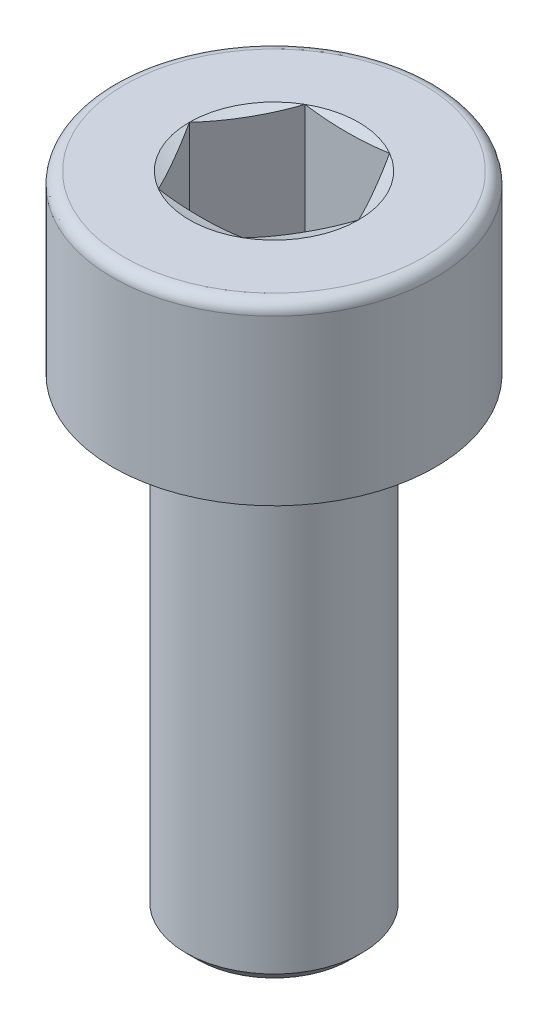
ISO-10303-21;
HEADER;
FILE_DESCRIPTION(('STEP AP214'),'2;1');
FILE_NAME('part.step','',(''),(''),'','','');
FILE_SCHEMA(('AUTOMOTIVE_DESIGN { 1 0 10303 214 1 1 1 1 }'));
ENDSEC;
DATA;
#1=APPLICATION_CONTEXT('core data for automotive mechanical design processes');
#2=APPLICATION_PROTOCOL_DEFINITION('international standard','automotive_design',2000,#1);
#3=PRODUCT_CONTEXT('',#1,'mechanical');
#4=PRODUCT('Part','Part','',(#3));
#5=PRODUCT_RELATED_PRODUCT_CATEGORY('part','',(#4));
#6=PRODUCT_DEFINITION_FORMATION('','',#4);
#7=PRODUCT_DEFINITION_CONTEXT('part definition',#1,'design');
#8=PRODUCT_DEFINITION('design','',#6,#7);
#9=PRODUCT_DEFINITION_SHAPE('','',#8);
#10=(LENGTH_UNIT() NAMED_UNIT(*) SI_UNIT(.MILLI.,.METRE.));
#11=(NAMED_UNIT(*) PLANE_ANGLE_UNIT() SI_UNIT($,.RADIAN.));
#12=(NAMED_UNIT(*) SI_UNIT($,.STERADIAN.) SOLID_ANGLE_UNIT());
#13=UNCERTAINTY_MEASURE_WITH_UNIT(LENGTH_MEASURE(1.E-05),#10,'distance_accuracy_value','');
#14=(GEOMETRIC_REPRESENTATION_CONTEXT(3) GLOBAL_UNCERTAINTY_ASSIGNED_CONTEXT((#13)) GLOBAL_UNIT_ASSIGNED_CONTEXT((#10,
#11,#12)) REPRESENTATION_CONTEXT('',''));
#15=CARTESIAN_POINT('',(0.,0.,0.));
#16=DIRECTION('',(0.,0.,1.));
#17=DIRECTION('',(1.,0.,0.));
#18=AXIS2_PLACEMENT_3D('',#15,#16,#17);
#19=CARTESIAN_POINT('',(-0.721687836487032,1.,1.25));
#20=DIRECTION('',(-0.866025403784438,0.,0.5));
#21=DIRECTION('',(0.5,0.,0.866025403784438));
#22=AXIS2_PLACEMENT_3D('',#19,#20,#21);
#23=PLANE('',#22);
#24=CARTESIAN_POINT('',(-0.721687836487033,3.,1.25));
#25=CARTESIAN_POINT('',(-0.746513124830629,2.99197238531374,1.20700133927634));
#26=CARTESIAN_POINT('',(-0.77141135372941,2.98490176746172,1.16387634180517));
#27=CARTESIAN_POINT('',(-0.821315773136171,2.97255913474823,1.07743935187044));
#28=CARTESIAN_POINT('',(-0.846321947696915,2.96728686283765,1.03412738702829));
#29=CARTESIAN_POINT('',(-0.921207679089363,2.95403550093664,0.904421495494619));
#30=CARTESIAN_POINT('',(-0.971201450687432,2.94854460534836,0.817829743024769));
#31=CARTESIAN_POINT('',(-1.05639422799085,2.94434178449894,0.670271524297353));
#32=CARTESIAN_POINT('',(-1.091578665675,2.94410115539927,0.609330290592659));
#33=CARTESIAN_POINT('',(-1.16192112047074,2.94660140173926,0.487493584957328));
#34=CARTESIAN_POINT('',(-1.19707913913524,2.94934208553123,0.426598110336959));
#35=CARTESIAN_POINT('',(-1.26754233377786,2.95799567884213,0.304552277152318));
#36=CARTESIAN_POINT('',(-1.30284686200085,2.96393024637964,0.243403040532844));
#37=CARTESIAN_POINT('',(-1.37327394982157,2.9792802908976,0.121419746198257));
#38=CARTESIAN_POINT('',(-1.40839646122585,2.98869664635053,0.0605857719566225));
#39=CARTESIAN_POINT('',(-1.44337567297406,3.,0.));
#40=B_SPLINE_CURVE_WITH_KNOTS('',3,(#24,#25,#26,#27,#28,#29,#30,#31,#32,#33,#34,#35,#36,#37,#38,
#39),.UNSPECIFIED.,.F.,.F.,(4,2,2,2,2,2,2,4),(0.,0.150861973818663,0.301702374924401,
0.601886293911623,0.812941524612173,1.02398318885367,1.23647431745907,1.44901909526101),.UNSPECIFIED.);
#41=CARTESIAN_POINT('',(-0.721687836487033,3.,1.25));
#42=VERTEX_POINT('',#41);
#43=CARTESIAN_POINT('',(-1.44337567297406,3.,0.));
#44=VERTEX_POINT('',#43);
#45=EDGE_CURVE('E81',#42,#44,#40,.T.);
#46=ORIENTED_EDGE('',*,*,#45,.F.);
#47=DIRECTION('',(0.,1.,0.));
#48=VECTOR('',#47,1.);
#49=CARTESIAN_POINT('',(-0.721687836487032,1.,1.25));
#50=LINE('',#49,#48);
#51=CARTESIAN_POINT('',(-0.721687836487032,1.,1.25));
#52=VERTEX_POINT('',#51);
#53=EDGE_CURVE('E117',#42,#52,#50,.F.);
#54=ORIENTED_EDGE('',*,*,#53,.T.);
#55=DIRECTION('',(0.5,0.,0.866025403784438));
#56=VECTOR('',#55,1.);
#57=CARTESIAN_POINT('',(-0.721687836487032,1.,1.25));
#58=LINE('',#57,#56);
#59=CARTESIAN_POINT('',(-1.44337567297406,1.,0.));
#60=VERTEX_POINT('',#59);
#61=EDGE_CURVE('E90',#60,#52,#58,.T.);
#62=ORIENTED_EDGE('',*,*,#61,.F.);
#63=DIRECTION('',(0.,1.,0.));
#64=VECTOR('',#63,1.);
#65=CARTESIAN_POINT('',(-1.44337567297406,1.,0.));
#66=LINE('',#65,#64);
#67=EDGE_CURVE('E89',#60,#44,#66,.T.);
#68=ORIENTED_EDGE('',*,*,#67,.T.);
#69=EDGE_LOOP('',(#46,#54,#62,#68));
#70=FACE_BOUND('',#69,.T.);
#71=ADVANCED_FACE('F17',(#70),#23,.F.);
#72=CARTESIAN_POINT('',(-1.44337567297406,1.,0.));
#73=DIRECTION('',(-0.866025403784439,0.,-0.5));
#74=DIRECTION('',(-0.5,0.,0.866025403784439));
#75=AXIS2_PLACEMENT_3D('',#72,#73,#74);
#76=PLANE('',#75);
#77=CARTESIAN_POINT('',(-1.44337567297406,3.,0.));
#78=CARTESIAN_POINT('',(-1.41855038463047,2.99197238531374,-0.0429986607236559));
#79=CARTESIAN_POINT('',(-1.39365215573169,2.98490176746172,-0.0861236581948248));
#80=CARTESIAN_POINT('',(-1.34374773632493,2.97255913474823,-0.172560648129561));
#81=CARTESIAN_POINT('',(-1.31874156176418,2.96728686283765,-0.215872612971707));
#82=CARTESIAN_POINT('',(-1.24385583037173,2.95403550093664,-0.345578504505381));
#83=CARTESIAN_POINT('',(-1.19386205877367,2.94854460534836,-0.432170256975231));
#84=CARTESIAN_POINT('',(-1.10866928147025,2.94434178449894,-0.579728475702646));
#85=CARTESIAN_POINT('',(-1.0734848437861,2.94410115539927,-0.64066970940734));
#86=CARTESIAN_POINT('',(-1.00314238899036,2.94660140173926,-0.762506415042672));
#87=CARTESIAN_POINT('',(-0.967984370325861,2.94934208553123,-0.823401889663041));
#88=CARTESIAN_POINT('',(-0.897521175683237,2.95799567884213,-0.945447722847682));
#89=CARTESIAN_POINT('',(-0.862216647460244,2.96393024637964,-1.00659695946716));
#90=CARTESIAN_POINT('',(-0.791789559639533,2.9792802908976,-1.12858025380174));
#91=CARTESIAN_POINT('',(-0.756667048235251,2.98869664635053,-1.18941422804338));
#92=CARTESIAN_POINT('',(-0.721687836487034,3.,-1.25));
#93=B_SPLINE_CURVE_WITH_KNOTS('',3,(#77,#78,#79,#80,#81,#82,#83,#84,#85,#86,#87,#88,#89,#90,#91,
#92),.UNSPECIFIED.,.F.,.F.,(4,2,2,2,2,2,2,4),(0.,0.150861973818663,0.301702374924401,
0.601886293911623,0.812941524612173,1.02398318885367,1.23647431745907,1.449019095261),.UNSPECIFIED.);
#94=CARTESIAN_POINT('',(-0.721687836487032,3.,-1.25));
#95=VERTEX_POINT('',#94);
#96=EDGE_CURVE('E96',#44,#95,#93,.T.);
#97=ORIENTED_EDGE('',*,*,#96,.F.);
#98=ORIENTED_EDGE('',*,*,#67,.F.);
#99=DIRECTION('',(0.5,0.,-0.866025403784439));
#100=VECTOR('',#99,1.);
#101=CARTESIAN_POINT('',(-1.44337567297406,1.,0.));
#102=LINE('',#101,#100);
#103=CARTESIAN_POINT('',(-0.721687836487033,1.,-1.25));
#104=VERTEX_POINT('',#103);
#105=EDGE_CURVE('E228',#60,#104,#102,.T.);
#106=ORIENTED_EDGE('',*,*,#105,.T.);
#107=DIRECTION('',(0.,1.,0.));
#108=VECTOR('',#107,1.);
#109=CARTESIAN_POINT('',(-0.721687836487033,1.,-1.25));
#110=LINE('',#109,#108);
#111=EDGE_CURVE('E115',#104,#95,#110,.T.);
#112=ORIENTED_EDGE('',*,*,#111,.T.);
#113=EDGE_LOOP('',(#97,#98,#106,#112));
#114=FACE_BOUND('',#113,.T.);
#115=ADVANCED_FACE('F113',(#114),#76,.F.);
#116=CARTESIAN_POINT('',(0.721687836487032,1.,1.25));
#117=DIRECTION('',(0.,0.,1.));
#118=DIRECTION('',(1.,0.,0.));
#119=AXIS2_PLACEMENT_3D('',#116,#117,#118);
#120=PLANE('',#119);
#121=CARTESIAN_POINT('',(0.721687836487032,3.,1.25));
#122=CARTESIAN_POINT('',(0.67203725979984,2.99197238531374,1.25));
#123=CARTESIAN_POINT('',(0.622240802002277,2.98490176746172,1.25));
#124=CARTESIAN_POINT('',(0.522431963188756,2.97255913474823,1.25));
#125=CARTESIAN_POINT('',(0.472419614067267,2.96728686283765,1.25));
#126=CARTESIAN_POINT('',(0.322648151282372,2.95403550093664,1.25));
#127=CARTESIAN_POINT('',(0.222660608086233,2.94854460534836,1.25));
#128=CARTESIAN_POINT('',(0.0522750534794036,2.94434178449894,1.25));
#129=CARTESIAN_POINT('',(-0.0180938218889025,2.94410115539927,1.25));
#130=CARTESIAN_POINT('',(-0.158778731480374,2.94660140173926,1.25));
#131=CARTESIAN_POINT('',(-0.229094768809375,2.94934208553123,1.25));
#132=CARTESIAN_POINT('',(-0.370021158094624,2.95799567884213,1.25));
#133=CARTESIAN_POINT('',(-0.44063021454061,2.96393024637964,1.25));
#134=CARTESIAN_POINT('',(-0.581484390182033,2.9792802908976,1.25));
#135=CARTESIAN_POINT('',(-0.651729412990597,2.98869664635053,1.25));
#136=CARTESIAN_POINT('',(-0.721687836487032,3.,1.25));
#137=B_SPLINE_CURVE_WITH_KNOTS('',3,(#121,#122,#123,#124,#125,#126,#127,#128,#129,#130,#131,
#132,#133,#134,#135,#136),.UNSPECIFIED.,.F.,.F.,(4,2,2,2,2,2,2,4),(0.,0.150861973818663,
0.301702374924401,0.601886293911623,0.812941524612173,1.02398318885367,1.23647431745907,
1.44901909526101),.UNSPECIFIED.);
#138=CARTESIAN_POINT('',(0.721687836487033,3.,1.25));
#139=VERTEX_POINT('',#138);
#140=EDGE_CURVE('E75',#139,#42,#137,.T.);
#141=ORIENTED_EDGE('',*,*,#140,.F.);
#142=DIRECTION('',(0.,1.,0.));
#143=VECTOR('',#142,1.);
#144=CARTESIAN_POINT('',(0.721687836487032,1.,1.25));
#145=LINE('',#144,#143);
#146=CARTESIAN_POINT('',(0.721687836487032,1.,1.25));
#147=VERTEX_POINT('',#146);
#148=EDGE_CURVE('E211',#139,#147,#145,.F.);
#149=ORIENTED_EDGE('',*,*,#148,.T.);
#150=DIRECTION('',(1.,0.,0.));
#151=VECTOR('',#150,1.);
#152=CARTESIAN_POINT('',(-0.721687836487033,1.,1.25));
#153=LINE('',#152,#151);
#154=EDGE_CURVE('E232',#147,#52,#153,.F.);
#155=ORIENTED_EDGE('',*,*,#154,.T.);
#156=ORIENTED_EDGE('',*,*,#53,.F.);
#157=EDGE_LOOP('',(#141,#149,#155,#156));
#158=FACE_BOUND('',#157,.T.);
#159=ADVANCED_FACE('F138',(#158),#120,.F.);
#160=CARTESIAN_POINT('',(-0.721687836487033,1.,-1.25));
#161=DIRECTION('',(0.,-1.,0.));
#162=DIRECTION('',(0.,0.,-1.));
#163=AXIS2_PLACEMENT_3D('',#160,#161,#162);
#164=PLANE('',#163);
#165=ORIENTED_EDGE('',*,*,#61,.T.);
#166=ORIENTED_EDGE('',*,*,#154,.F.);
#167=DIRECTION('',(0.5,0.,-0.866025403784438));
#168=VECTOR('',#167,1.);
#169=CARTESIAN_POINT('',(1.44337567297406,1.,0.));
#170=LINE('',#169,#168);
#171=CARTESIAN_POINT('',(1.44337567297406,1.,0.));
#172=VERTEX_POINT('',#171);
#173=EDGE_CURVE('E160',#147,#172,#170,.T.);
#174=ORIENTED_EDGE('',*,*,#173,.T.);
#175=DIRECTION('',(-0.5,0.,-0.866025403784439));
#176=VECTOR('',#175,1.);
#177=CARTESIAN_POINT('',(0.721687836487033,1.,-1.25));
#178=LINE('',#177,#176);
#179=CARTESIAN_POINT('',(0.721687836487033,1.,-1.25));
#180=VERTEX_POINT('',#179);
#181=EDGE_CURVE('E208',#172,#180,#178,.T.);
#182=ORIENTED_EDGE('',*,*,#181,.T.);
#183=DIRECTION('',(-1.,0.,0.));
#184=VECTOR('',#183,1.);
#185=CARTESIAN_POINT('',(-0.721687836487033,1.,-1.25));
#186=LINE('',#185,#184);
#187=EDGE_CURVE('E223',#180,#104,#186,.T.);
#188=ORIENTED_EDGE('',*,*,#187,.T.);
#189=ORIENTED_EDGE('',*,*,#105,.F.);
#190=EDGE_LOOP('',(#165,#166,#174,#182,#188,#189));
#191=FACE_BOUND('',#190,.T.);
#192=ADVANCED_FACE('F142',(#191),#164,.F.);
#193=CARTESIAN_POINT('',(-0.721687836487033,1.,-1.25));
#194=DIRECTION('',(0.,0.,-1.));
#195=DIRECTION('',(-1.,0.,0.));
#196=AXIS2_PLACEMENT_3D('',#193,#194,#195);
#197=PLANE('',#196);
#198=CARTESIAN_POINT('',(-0.721687836487032,3.,-1.25));
#199=CARTESIAN_POINT('',(-0.67203725979984,2.99197238531374,-1.25));
#200=CARTESIAN_POINT('',(-0.622240802002277,2.98490176746172,-1.25));
#201=CARTESIAN_POINT('',(-0.522431963188756,2.97255913474823,-1.25));
#202=CARTESIAN_POINT('',(-0.472419614067266,2.96728686283765,-1.25));
#203=CARTESIAN_POINT('',(-0.322648151282372,2.95403550093664,-1.25));
#204=CARTESIAN_POINT('',(-0.222660608086233,2.94854460534836,-1.25));
#205=CARTESIAN_POINT('',(-0.0522750534794031,2.94434178449894,-1.25));
#206=CARTESIAN_POINT('',(0.0180938218889032,2.94410115539927,-1.25));
#207=CARTESIAN_POINT('',(0.158778731480375,2.94660140173926,-1.25));
#208=CARTESIAN_POINT('',(0.229094768809376,2.94934208553123,-1.25));
#209=CARTESIAN_POINT('',(0.370021158094625,2.95799567884213,-1.25));
#210=CARTESIAN_POINT('',(0.440630214540611,2.96393024637964,-1.25));
#211=CARTESIAN_POINT('',(0.581484390182034,2.9792802908976,-1.25));
#212=CARTESIAN_POINT('',(0.651729412990599,2.98869664635053,-1.25));
#213=CARTESIAN_POINT('',(0.721687836487033,3.,-1.25));
#214=B_SPLINE_CURVE_WITH_KNOTS('',3,(#198,#199,#200,#201,#202,#203,#204,#205,#206,#207,#208,
#209,#210,#211,#212,#213),.UNSPECIFIED.,.F.,.F.,(4,2,2,2,2,2,2,4),(0.,0.150861973818663,
0.301702374924401,0.601886293911623,0.812941524612174,1.02398318885367,1.23647431745908,
1.44901909526101),.UNSPECIFIED.);
#215=CARTESIAN_POINT('',(0.721687836487033,3.,-1.25));
#216=VERTEX_POINT('',#215);
#217=EDGE_CURVE('E155',#95,#216,#214,.T.);
#218=ORIENTED_EDGE('',*,*,#217,.F.);
#219=ORIENTED_EDGE('',*,*,#111,.F.);
#220=ORIENTED_EDGE('',*,*,#187,.F.);
#221=DIRECTION('',(0.,1.,0.));
#222=VECTOR('',#221,1.);
#223=CARTESIAN_POINT('',(0.721687836487033,1.,-1.25));
#224=LINE('',#223,#222);
#225=EDGE_CURVE('E203',#180,#216,#224,.T.);
#226=ORIENTED_EDGE('',*,*,#225,.T.);
#227=EDGE_LOOP('',(#218,#219,#220,#226));
#228=FACE_BOUND('',#227,.T.);
#229=ADVANCED_FACE('F146',(#228),#197,.F.);
#230=CARTESIAN_POINT('',(1.44337567297406,1.,0.));
#231=DIRECTION('',(0.866025403784438,0.,0.5));
#232=DIRECTION('',(0.5,0.,-0.866025403784438));
#233=AXIS2_PLACEMENT_3D('',#230,#231,#232);
#234=PLANE('',#233);
#235=CARTESIAN_POINT('',(1.44337567297406,3.,0.));
#236=CARTESIAN_POINT('',(1.41855038463047,2.99197238531374,0.042998660723657));
#237=CARTESIAN_POINT('',(1.39365215573169,2.98490176746172,0.0861236581948259));
#238=CARTESIAN_POINT('',(1.34374773632493,2.97255913474823,0.172560648129562));
#239=CARTESIAN_POINT('',(1.31874156176418,2.96728686283765,0.215872612971708));
#240=CARTESIAN_POINT('',(1.24385583037173,2.95403550093664,0.345578504505382));
#241=CARTESIAN_POINT('',(1.19386205877366,2.94854460534836,0.432170256975232));
#242=CARTESIAN_POINT('',(1.10866928147025,2.94434178449894,0.579728475702648));
#243=CARTESIAN_POINT('',(1.0734848437861,2.94410115539927,0.640669709407342));
#244=CARTESIAN_POINT('',(1.00314238899036,2.94660140173926,0.762506415042673));
#245=CARTESIAN_POINT('',(0.96798437032586,2.94934208553123,0.823401889663042));
#246=CARTESIAN_POINT('',(0.897521175683236,2.95799567884213,0.945447722847683));
#247=CARTESIAN_POINT('',(0.862216647460243,2.96393024637964,1.00659695946716));
#248=CARTESIAN_POINT('',(0.791789559639531,2.9792802908976,1.12858025380174));
#249=CARTESIAN_POINT('',(0.756667048235249,2.98869664635053,1.18941422804338));
#250=CARTESIAN_POINT('',(0.721687836487032,3.,1.25));
#251=B_SPLINE_CURVE_WITH_KNOTS('',3,(#235,#236,#237,#238,#239,#240,#241,#242,#243,#244,#245,
#246,#247,#248,#249,#250),.UNSPECIFIED.,.F.,.F.,(4,2,2,2,2,2,2,4),(0.,0.150861973818663,
0.301702374924401,0.601886293911623,0.812941524612173,1.02398318885367,1.23647431745907,
1.44901909526101),.UNSPECIFIED.);
#252=CARTESIAN_POINT('',(1.44337567297406,3.,0.));
#253=VERTEX_POINT('',#252);
#254=EDGE_CURVE('E161',#253,#139,#251,.T.);
#255=ORIENTED_EDGE('',*,*,#254,.F.);
#256=DIRECTION('',(0.,1.,0.));
#257=VECTOR('',#256,1.);
#258=CARTESIAN_POINT('',(1.44337567297407,1.,0.));
#259=LINE('',#258,#257);
#260=EDGE_CURVE('E199',#253,#172,#259,.F.);
#261=ORIENTED_EDGE('',*,*,#260,.T.);
#262=ORIENTED_EDGE('',*,*,#173,.F.);
#263=ORIENTED_EDGE('',*,*,#148,.F.);
#264=EDGE_LOOP('',(#255,#261,#262,#263));
#265=FACE_BOUND('',#264,.T.);
#266=ADVANCED_FACE('F151',(#265),#234,.F.);
#267=CARTESIAN_POINT('',(0.721687836487033,1.,-1.25));
#268=DIRECTION('',(0.866025403784439,0.,-0.5));
#269=DIRECTION('',(-0.5,0.,-0.866025403784439));
#270=AXIS2_PLACEMENT_3D('',#267,#268,#269);
#271=PLANE('',#270);
#272=CARTESIAN_POINT('',(1.44337567297407,3.,0.));
#273=CARTESIAN_POINT('',(1.41855038463047,2.99197238531374,-0.0429986607236551));
#274=CARTESIAN_POINT('',(1.39365215573169,2.98490176746172,-0.086123658194824));
#275=CARTESIAN_POINT('',(1.34374773632493,2.97255913474823,-0.17256064812956));
#276=CARTESIAN_POINT('',(1.31874156176418,2.96728686283765,-0.215872612971706));
#277=CARTESIAN_POINT('',(1.24385583037174,2.95403550093664,-0.34557850450538));
#278=CARTESIAN_POINT('',(1.19386205877367,2.94854460534836,-0.432170256975231));
#279=CARTESIAN_POINT('',(1.10866928147025,2.94434178449894,-0.579728475702646));
#280=CARTESIAN_POINT('',(1.0734848437861,2.94410115539927,-0.64066970940734));
#281=CARTESIAN_POINT('',(1.00314238899036,2.94660140173926,-0.762506415042671));
#282=CARTESIAN_POINT('',(0.967984370325862,2.94934208553123,-0.82340188966304));
#283=CARTESIAN_POINT('',(0.897521175683238,2.95799567884213,-0.945447722847681));
#284=CARTESIAN_POINT('',(0.862216647460245,2.96393024637964,-1.00659695946715));
#285=CARTESIAN_POINT('',(0.791789559639533,2.9792802908976,-1.12858025380174));
#286=CARTESIAN_POINT('',(0.756667048235251,2.98869664635053,-1.18941422804338));
#287=CARTESIAN_POINT('',(0.721687836487034,3.,-1.25));
#288=B_SPLINE_CURVE_WITH_KNOTS('',3,(#272,#273,#274,#275,#276,#277,#278,#279,#280,#281,#282,
#283,#284,#285,#286,#287),.UNSPECIFIED.,.F.,.F.,(4,2,2,2,2,2,2,4),(0.,0.150861973818663,
0.301702374924401,0.601886293911622,0.812941524612173,1.02398318885367,1.23647431745907,
1.44901909526101),.UNSPECIFIED.);
#289=EDGE_CURVE('E202',#253,#216,#288,.T.);
#290=ORIENTED_EDGE('',*,*,#289,.T.);
#291=ORIENTED_EDGE('',*,*,#225,.F.);
#292=ORIENTED_EDGE('',*,*,#181,.F.);
#293=ORIENTED_EDGE('',*,*,#260,.F.);
#294=EDGE_LOOP('',(#290,#291,#292,#293));
#295=FACE_BOUND('',#294,.T.);
#296=ADVANCED_FACE('F194',(#295),#271,.F.);
#297=CARTESIAN_POINT('',(-0.520457544102293,5.85450908693594,0.));
#298=DIRECTION('',(0.,0.,1.));
#299=DIRECTION('',(-1.,0.,0.));
#300=AXIS2_PLACEMENT_3D('',#297,#298,#299);
#301=CIRCLE('',#300,3.);
#302=TRIMMED_CURVE('',#301,(PARAMETER_VALUE(-1.74516442055986)),
(PARAMETER_VALUE(1.74516442055986)),.T.,.PARAMETER.);
#303=CARTESIAN_POINT('',(0.,5.85450908693594,0.));
#304=DIRECTION('',(0.,1.,0.));
#305=AXIS1_PLACEMENT('',#303,#304);
#306=SURFACE_OF_REVOLUTION('',#302,#305);
#307=ORIENTED_EDGE('',*,*,#254,.T.);
#308=CARTESIAN_POINT('',(0.,3.,0.));
#309=DIRECTION('',(0.,1.,0.));
#310=DIRECTION('',(-1.,0.,0.));
#311=AXIS2_PLACEMENT_3D('',#308,#309,#310);
#312=CIRCLE('',#311,1.44337567297407);
#313=EDGE_CURVE('E259',#253,#139,#312,.F.);
#314=ORIENTED_EDGE('',*,*,#313,.F.);
#315=EDGE_LOOP('',(#307,#314));
#316=FACE_BOUND('',#315,.T.);
#317=ADVANCED_FACE('F191',(#316),#306,.T.);
#318=CARTESIAN_POINT('',(-0.520457544102293,5.85450908693594,0.));
#319=DIRECTION('',(0.,0.,1.));
#320=DIRECTION('',(-1.,0.,0.));
#321=AXIS2_PLACEMENT_3D('',#318,#319,#320);
#322=CIRCLE('',#321,3.);
#323=TRIMMED_CURVE('',#322,(PARAMETER_VALUE(-1.74516442055986)),
(PARAMETER_VALUE(1.74516442055986)),.T.,.PARAMETER.);
#324=CARTESIAN_POINT('',(0.,5.85450908693594,0.));
#325=DIRECTION('',(0.,1.,0.));
#326=AXIS1_PLACEMENT('',#324,#325);
#327=SURFACE_OF_REVOLUTION('',#323,#326);
#328=ORIENTED_EDGE('',*,*,#140,.T.);
#329=CARTESIAN_POINT('',(0.,3.,0.));
#330=DIRECTION('',(0.,1.,0.));
#331=DIRECTION('',(-1.,0.,0.));
#332=AXIS2_PLACEMENT_3D('',#329,#330,#331);
#333=CIRCLE('',#332,1.44337567297406);
#334=EDGE_CURVE('E106',#139,#42,#333,.F.);
#335=ORIENTED_EDGE('',*,*,#334,.F.);
#336=EDGE_LOOP('',(#328,#335));
#337=FACE_BOUND('',#336,.T.);
#338=ADVANCED_FACE('F188',(#337),#327,.T.);
#339=CARTESIAN_POINT('',(-0.520457544102293,5.85450908693594,0.));
#340=DIRECTION('',(0.,0.,1.));
#341=DIRECTION('',(-1.,0.,0.));
#342=AXIS2_PLACEMENT_3D('',#339,#340,#341);
#343=CIRCLE('',#342,3.);
#344=TRIMMED_CURVE('',#343,(PARAMETER_VALUE(-1.74516442055986)),
(PARAMETER_VALUE(1.74516442055986)),.T.,.PARAMETER.);
#345=CARTESIAN_POINT('',(0.,5.85450908693594,0.));
#346=DIRECTION('',(0.,1.,0.));
#347=AXIS1_PLACEMENT('',#345,#346);
#348=SURFACE_OF_REVOLUTION('',#344,#347);
#349=ORIENTED_EDGE('',*,*,#45,.T.);
#350=CARTESIAN_POINT('',(0.,3.,0.));
#351=DIRECTION('',(0.,1.,0.));
#352=DIRECTION('',(-1.,0.,0.));
#353=AXIS2_PLACEMENT_3D('',#350,#351,#352);
#354=CIRCLE('',#353,1.44337567297406);
#355=EDGE_CURVE('E85',#42,#44,#354,.F.);
#356=ORIENTED_EDGE('',*,*,#355,.F.);
#357=EDGE_LOOP('',(#349,#356));
#358=FACE_BOUND('',#357,.T.);
#359=ADVANCED_FACE('F83',(#358),#348,.T.);
#360=CARTESIAN_POINT('',(-0.520457544102293,5.85450908693594,0.));
#361=DIRECTION('',(0.,0.,1.));
#362=DIRECTION('',(-1.,0.,0.));
#363=AXIS2_PLACEMENT_3D('',#360,#361,#362);
#364=CIRCLE('',#363,3.);
#365=TRIMMED_CURVE('',#364,(PARAMETER_VALUE(-1.74516442055986)),
(PARAMETER_VALUE(1.74516442055986)),.T.,.PARAMETER.);
#366=CARTESIAN_POINT('',(0.,5.85450908693594,0.));
#367=DIRECTION('',(0.,1.,0.));
#368=AXIS1_PLACEMENT('',#366,#367);
#369=SURFACE_OF_REVOLUTION('',#365,#368);
#370=ORIENTED_EDGE('',*,*,#96,.T.);
#371=CARTESIAN_POINT('',(0.,3.,0.));
#372=DIRECTION('',(0.,1.,0.));
#373=DIRECTION('',(-1.,0.,0.));
#374=AXIS2_PLACEMENT_3D('',#371,#372,#373);
#375=CIRCLE('',#374,1.44337567297406);
#376=EDGE_CURVE('E103',#44,#95,#375,.F.);
#377=ORIENTED_EDGE('',*,*,#376,.F.);
#378=EDGE_LOOP('',(#370,#377));
#379=FACE_BOUND('',#378,.T.);
#380=ADVANCED_FACE('F109',(#379),#369,.T.);
#381=CARTESIAN_POINT('',(-0.520457544102293,5.85450908693594,0.));
#382=DIRECTION('',(0.,0.,1.));
#383=DIRECTION('',(-1.,0.,0.));
#384=AXIS2_PLACEMENT_3D('',#381,#382,#383);
#385=CIRCLE('',#384,3.);
#386=TRIMMED_CURVE('',#385,(PARAMETER_VALUE(-1.74516442055986)),
(PARAMETER_VALUE(1.74516442055986)),.T.,.PARAMETER.);
#387=CARTESIAN_POINT('',(0.,5.85450908693594,0.));
#388=DIRECTION('',(0.,1.,0.));
#389=AXIS1_PLACEMENT('',#387,#388);
#390=SURFACE_OF_REVOLUTION('',#386,#389);
#391=ORIENTED_EDGE('',*,*,#217,.T.);
#392=CARTESIAN_POINT('',(0.,3.,0.));
#393=DIRECTION('',(0.,1.,0.));
#394=DIRECTION('',(-1.,0.,0.));
#395=AXIS2_PLACEMENT_3D('',#392,#393,#394);
#396=CIRCLE('',#395,1.44337567297406);
#397=EDGE_CURVE('E111',#95,#216,#396,.F.);
#398=ORIENTED_EDGE('',*,*,#397,.F.);
#399=EDGE_LOOP('',(#391,#398));
#400=FACE_BOUND('',#399,.T.);
#401=ADVANCED_FACE('F167',(#400),#390,.T.);
#402=CARTESIAN_POINT('',(-0.520457544102293,5.85450908693594,0.));
#403=DIRECTION('',(0.,0.,1.));
#404=DIRECTION('',(-1.,0.,0.));
#405=AXIS2_PLACEMENT_3D('',#402,#403,#404);
#406=CIRCLE('',#405,3.);
#407=TRIMMED_CURVE('',#406,(PARAMETER_VALUE(-1.74516442055986)),
(PARAMETER_VALUE(1.74516442055986)),.T.,.PARAMETER.);
#408=CARTESIAN_POINT('',(0.,5.85450908693594,0.));
#409=DIRECTION('',(0.,1.,0.));
#410=AXIS1_PLACEMENT('',#408,#409);
#411=SURFACE_OF_REVOLUTION('',#407,#410);
#412=ORIENTED_EDGE('',*,*,#289,.F.);
#413=CARTESIAN_POINT('',(0.,3.,0.));
#414=DIRECTION('',(0.,1.,0.));
#415=DIRECTION('',(-1.,0.,0.));
#416=AXIS2_PLACEMENT_3D('',#413,#414,#415);
#417=CIRCLE('',#416,1.44337567297406);
#418=EDGE_CURVE('E254',#216,#253,#417,.F.);
#419=ORIENTED_EDGE('',*,*,#418,.F.);
#420=EDGE_LOOP('',(#412,#419));
#421=FACE_BOUND('',#420,.T.);
#422=ADVANCED_FACE('F172',(#421),#411,.T.);
#423=CARTESIAN_POINT('',(0.,3.,0.));
#424=DIRECTION('',(0.,1.,0.));
#425=DIRECTION('',(0.,0.,1.));
#426=AXIS2_PLACEMENT_3D('',#423,#424,#425);
#427=PLANE('',#426);
#428=CARTESIAN_POINT('',(0.,3.,0.));
#429=DIRECTION('',(0.,-1.,0.));
#430=DIRECTION('',(0.,0.,-1.));
#431=AXIS2_PLACEMENT_3D('',#428,#429,#430);
#432=CIRCLE('',#431,2.55);
#433=CARTESIAN_POINT('',(0.,3.,-2.55));
#434=VERTEX_POINT('',#433);
#435=CARTESIAN_POINT('',(0.,3.,2.55));
#436=VERTEX_POINT('',#435);
#437=EDGE_CURVE('E37',#434,#436,#432,.T.);
#438=ORIENTED_EDGE('',*,*,#437,.F.);
#439=CARTESIAN_POINT('',(0.,3.,0.));
#440=DIRECTION('',(0.,-1.,0.));
#441=DIRECTION('',(0.,0.,1.));
#442=AXIS2_PLACEMENT_3D('',#439,#440,#441);
#443=CIRCLE('',#442,2.55);
#444=EDGE_CURVE('E327',#436,#434,#443,.T.);
#445=ORIENTED_EDGE('',*,*,#444,.F.);
#446=EDGE_LOOP('',(#438,#445));
#447=FACE_BOUND('',#446,.T.);
#448=ORIENTED_EDGE('',*,*,#397,.T.);
#449=ORIENTED_EDGE('',*,*,#418,.T.);
#450=ORIENTED_EDGE('',*,*,#313,.T.);
#451=ORIENTED_EDGE('',*,*,#334,.T.);
#452=ORIENTED_EDGE('',*,*,#355,.T.);
#453=ORIENTED_EDGE('',*,*,#376,.T.);
#454=EDGE_LOOP('',(#448,#449,#450,#451,#452,#453));
#455=FACE_BOUND('',#454,.T.);
#456=ADVANCED_FACE('F102',(#447,#455),#427,.T.);
#457=CARTESIAN_POINT('',(0.,2.8,0.));
#458=DIRECTION('',(0.,1.,0.));
#459=DIRECTION('',(0.,0.,1.));
#460=AXIS2_PLACEMENT_3D('',#457,#458,#459);
#461=TOROIDAL_SURFACE('',#460,2.55,0.2);
#462=CARTESIAN_POINT('',(0.,2.8,0.));
#463=DIRECTION('',(0.,-1.,0.));
#464=DIRECTION('',(0.,0.,-1.));
#465=AXIS2_PLACEMENT_3D('',#462,#463,#464);
#466=CIRCLE('',#465,2.75);
#467=CARTESIAN_POINT('',(0.,2.8,-2.75));
#468=VERTEX_POINT('',#467);
#469=EDGE_CURVE('E253',#468,#468,#466,.T.);
#470=ORIENTED_EDGE('',*,*,#469,.F.);
#471=EDGE_LOOP('',(#470));
#472=FACE_BOUND('',#471,.T.);
#473=ORIENTED_EDGE('',*,*,#444,.T.);
#474=ORIENTED_EDGE('',*,*,#437,.T.);
#475=EDGE_LOOP('',(#473,#474));
#476=FACE_BOUND('',#475,.T.);
#477=ADVANCED_FACE('F304',(#472,#476),#461,.T.);
#478=CARTESIAN_POINT('',(0.,-8.,0.));
#479=DIRECTION('',(0.,-1.,0.));
#480=DIRECTION('',(0.,0.,-1.));
#481=AXIS2_PLACEMENT_3D('',#478,#479,#480);
#482=PLANE('',#481);
#483=CARTESIAN_POINT('',(0.,-8.0000000000382,0.));
#484=DIRECTION('',(0.,1.,0.));
#485=DIRECTION('',(0.,0.,1.));
#486=AXIS2_PLACEMENT_3D('',#483,#484,#485);
#487=CIRCLE('',#486,1.29999999995789);
#488=CARTESIAN_POINT('',(0.,-8.0000000000382,1.29999999995789));
#489=VERTEX_POINT('',#488);
#490=EDGE_CURVE('E250',#489,#489,#487,.T.);
#491=ORIENTED_EDGE('',*,*,#490,.F.);
#492=EDGE_LOOP('',(#491));
#493=FACE_BOUND('',#492,.T.);
#494=ADVANCED_FACE('F301',(#493),#482,.T.);
#495=CARTESIAN_POINT('',(0.,3.,0.));
#496=DIRECTION('',(0.,-1.,0.));
#497=DIRECTION('',(0.,0.,-1.));
#498=AXIS2_PLACEMENT_3D('',#495,#496,#497);
#499=CYLINDRICAL_SURFACE('',#498,2.75);
#500=ORIENTED_EDGE('',*,*,#469,.T.);
#501=EDGE_LOOP('',(#500));
#502=FACE_BOUND('',#501,.T.);
#503=CARTESIAN_POINT('',(0.,0.,0.));
#504=DIRECTION('',(0.,-1.,0.));
#505=DIRECTION('',(0.,0.,-1.));
#506=AXIS2_PLACEMENT_3D('',#503,#504,#505);
#507=CIRCLE('',#506,2.75);
#508=CARTESIAN_POINT('',(0.,0.,-2.75));
#509=VERTEX_POINT('',#508);
#510=EDGE_CURVE('E247',#509,#509,#507,.F.);
#511=ORIENTED_EDGE('',*,*,#510,.T.);
#512=EDGE_LOOP('',(#511));
#513=FACE_BOUND('',#512,.T.);
#514=ADVANCED_FACE('F297',(#502,#513),#499,.T.);
#515=CARTESIAN_POINT('',(0.,-7.80000000003156,0.));
#516=DIRECTION('',(0.,1.,0.));
#517=DIRECTION('',(0.,0.,1.));
#518=AXIS2_PLACEMENT_3D('',#515,#516,#517);
#519=CONICAL_SURFACE('',#518,1.50000000002137,0.785398163539557);
#520=CARTESIAN_POINT('',(0.,-7.8,0.));
#521=DIRECTION('',(0.,1.,0.));
#522=DIRECTION('',(0.,0.,1.));
#523=AXIS2_PLACEMENT_3D('',#520,#521,#522);
#524=CIRCLE('',#523,1.5);
#525=CARTESIAN_POINT('',(0.,-7.8,1.5));
#526=VERTEX_POINT('',#525);
#527=EDGE_CURVE('E29',#526,#526,#524,.T.);
#528=ORIENTED_EDGE('',*,*,#527,.F.);
#529=EDGE_LOOP('',(#528));
#530=FACE_BOUND('',#529,.T.);
#531=ORIENTED_EDGE('',*,*,#490,.T.);
#532=EDGE_LOOP('',(#531));
#533=FACE_BOUND('',#532,.T.);
#534=ADVANCED_FACE('F290',(#530,#533),#519,.T.);
#535=CARTESIAN_POINT('',(0.,0.,0.));
#536=DIRECTION('',(0.,1.,0.));
#537=DIRECTION('',(0.,0.,1.));
#538=AXIS2_PLACEMENT_3D('',#535,#536,#537);
#539=PLANE('',#538);
#540=CARTESIAN_POINT('',(0.,0.,0.));
#541=DIRECTION('',(0.,1.,0.));
#542=DIRECTION('',(0.,0.,1.));
#543=AXIS2_PLACEMENT_3D('',#540,#541,#542);
#544=CIRCLE('',#543,1.5);
#545=CARTESIAN_POINT('',(0.,0.,1.5));
#546=VERTEX_POINT('',#545);
#547=EDGE_CURVE('E11',#546,#546,#544,.F.);
#548=ORIENTED_EDGE('',*,*,#547,.F.);
#549=EDGE_LOOP('',(#548));
#550=FACE_BOUND('',#549,.T.);
#551=ORIENTED_EDGE('',*,*,#510,.F.);
#552=EDGE_LOOP('',(#551));
#553=FACE_BOUND('',#552,.T.);
#554=ADVANCED_FACE('F284',(#550,#553),#539,.F.);
#555=CARTESIAN_POINT('',(0.,-8.,0.));
#556=DIRECTION('',(0.,1.,0.));
#557=DIRECTION('',(0.,0.,1.));
#558=AXIS2_PLACEMENT_3D('',#555,#556,#557);
#559=CYLINDRICAL_SURFACE('',#558,1.5);
#560=ORIENTED_EDGE('',*,*,#547,.T.);
#561=EDGE_LOOP('',(#560));
#562=FACE_BOUND('',#561,.T.);
#563=ORIENTED_EDGE('',*,*,#527,.T.);
#564=EDGE_LOOP('',(#563));
#565=FACE_BOUND('',#564,.T.);
#566=ADVANCED_FACE('F282',(#562,#565),#559,.T.);
#567=CLOSED_SHELL('',(#71,#115,#159,#192,#229,#266,#296,#317,#338,#359,#380,#401,#422,#456,#477,
#494,#514,#534,#554,#566));
#568=MANIFOLD_SOLID_BREP('B1',#567);
#569=ADVANCED_BREP_SHAPE_REPRESENTATION('',(#18,#568),#14);
#570=SHAPE_DEFINITION_REPRESENTATION(#9,#569);
ENDSEC;
END-ISO-10303-21;
